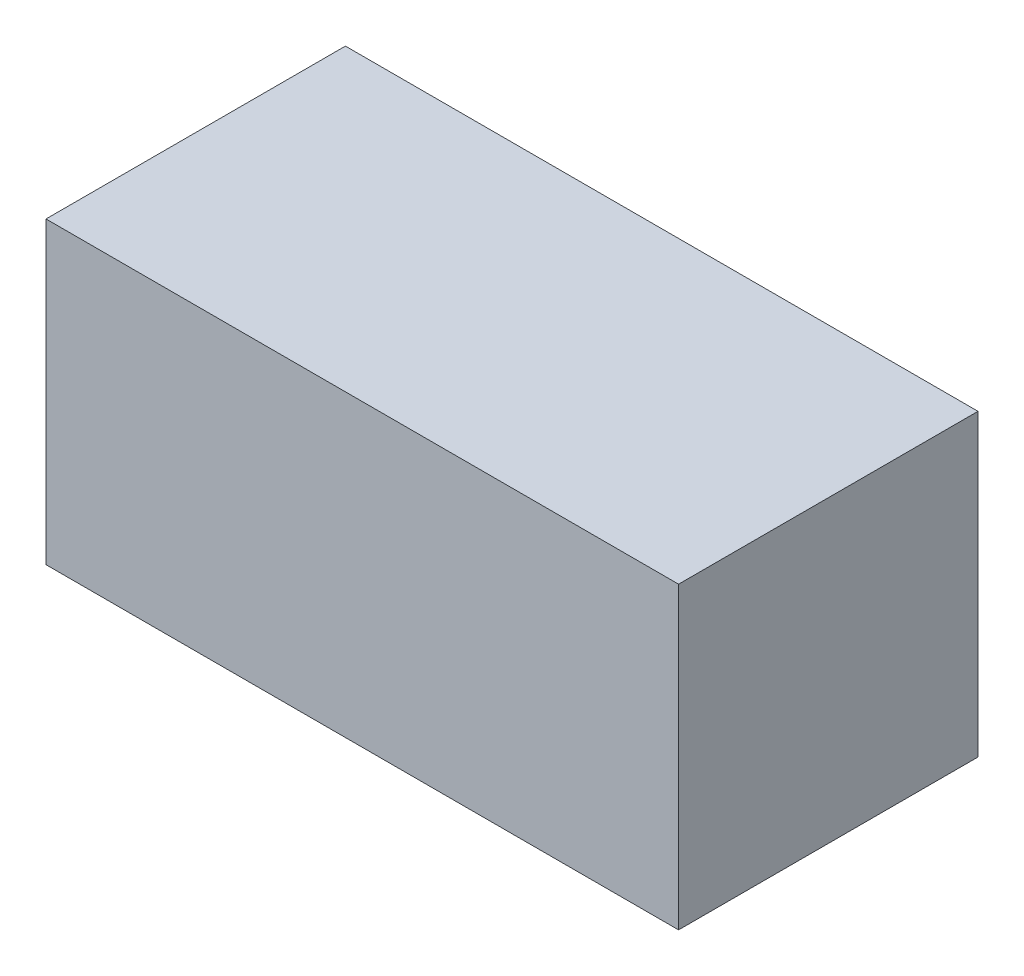
ISO-10303-21;
HEADER;
FILE_DESCRIPTION(('STEP AP214'),'2;1');
FILE_NAME('part.step','',(''),(''),'','','');
FILE_SCHEMA(('AUTOMOTIVE_DESIGN { 1 0 10303 214 1 1 1 1 }'));
ENDSEC;
DATA;
#1=APPLICATION_CONTEXT('core data for automotive mechanical design processes');
#2=APPLICATION_PROTOCOL_DEFINITION('international standard','automotive_design',2000,#1);
#3=PRODUCT_CONTEXT('',#1,'mechanical');
#4=PRODUCT('Part','Part','',(#3));
#5=PRODUCT_RELATED_PRODUCT_CATEGORY('part','',(#4));
#6=PRODUCT_DEFINITION_FORMATION('','',#4);
#7=PRODUCT_DEFINITION_CONTEXT('part definition',#1,'design');
#8=PRODUCT_DEFINITION('design','',#6,#7);
#9=PRODUCT_DEFINITION_SHAPE('','',#8);
#10=(LENGTH_UNIT() NAMED_UNIT(*) SI_UNIT(.MILLI.,.METRE.));
#11=(NAMED_UNIT(*) PLANE_ANGLE_UNIT() SI_UNIT($,.RADIAN.));
#12=(NAMED_UNIT(*) SI_UNIT($,.STERADIAN.) SOLID_ANGLE_UNIT());
#13=UNCERTAINTY_MEASURE_WITH_UNIT(LENGTH_MEASURE(1.E-05),#10,'distance_accuracy_value','');
#14=(GEOMETRIC_REPRESENTATION_CONTEXT(3) GLOBAL_UNCERTAINTY_ASSIGNED_CONTEXT((#13)) GLOBAL_UNIT_ASSIGNED_CONTEXT((#10,
#11,#12)) REPRESENTATION_CONTEXT('',''));
#15=CARTESIAN_POINT('',(0.,0.,0.));
#16=DIRECTION('',(0.,0.,1.));
#17=DIRECTION('',(1.,0.,0.));
#18=AXIS2_PLACEMENT_3D('',#15,#16,#17);
#19=CARTESIAN_POINT('',(37.5,-17.75,35.5));
#20=DIRECTION('',(-1.,0.,0.));
#21=DIRECTION('',(0.,0.,1.));
#22=AXIS2_PLACEMENT_3D('',#19,#20,#21);
#23=PLANE('',#22);
#24=DIRECTION('',(0.,1.,0.));
#25=VECTOR('',#24,1.);
#26=CARTESIAN_POINT('',(37.5,-17.75,0.));
#27=LINE('',#26,#25);
#28=CARTESIAN_POINT('',(37.5,-17.75,0.));
#29=VERTEX_POINT('',#28);
#30=CARTESIAN_POINT('',(37.5,17.75,0.));
#31=VERTEX_POINT('',#30);
#32=EDGE_CURVE('E102',#29,#31,#27,.T.);
#33=ORIENTED_EDGE('',*,*,#32,.T.);
#34=DIRECTION('',(0.,0.,-1.));
#35=VECTOR('',#34,1.);
#36=CARTESIAN_POINT('',(37.5,17.75,35.5));
#37=LINE('',#36,#35);
#38=CARTESIAN_POINT('',(37.5,17.75,35.5));
#39=VERTEX_POINT('',#38);
#40=EDGE_CURVE('E11',#39,#31,#37,.T.);
#41=ORIENTED_EDGE('',*,*,#40,.F.);
#42=DIRECTION('',(0.,1.,0.));
#43=VECTOR('',#42,1.);
#44=CARTESIAN_POINT('',(37.5,-17.75,35.5));
#45=LINE('',#44,#43);
#46=CARTESIAN_POINT('',(37.5,-17.75,35.5));
#47=VERTEX_POINT('',#46);
#48=EDGE_CURVE('E90',#47,#39,#45,.T.);
#49=ORIENTED_EDGE('',*,*,#48,.F.);
#50=DIRECTION('',(0.,0.,-1.));
#51=VECTOR('',#50,1.);
#52=CARTESIAN_POINT('',(37.5,-17.75,35.5));
#53=LINE('',#52,#51);
#54=EDGE_CURVE('E98',#47,#29,#53,.T.);
#55=ORIENTED_EDGE('',*,*,#54,.T.);
#56=EDGE_LOOP('',(#33,#41,#49,#55));
#57=FACE_BOUND('',#56,.T.);
#58=ADVANCED_FACE('F39',(#57),#23,.F.);
#59=CARTESIAN_POINT('',(-37.5,17.75,35.5));
#60=DIRECTION('',(0.,-1.,0.));
#61=DIRECTION('',(0.,0.,-1.));
#62=AXIS2_PLACEMENT_3D('',#59,#60,#61);
#63=PLANE('',#62);
#64=DIRECTION('',(-1.,0.,0.));
#65=VECTOR('',#64,1.);
#66=CARTESIAN_POINT('',(-37.5,17.75,0.));
#67=LINE('',#66,#65);
#68=CARTESIAN_POINT('',(-37.5,17.75,0.));
#69=VERTEX_POINT('',#68);
#70=EDGE_CURVE('E94',#31,#69,#67,.T.);
#71=ORIENTED_EDGE('',*,*,#70,.T.);
#72=DIRECTION('',(0.,0.,-1.));
#73=VECTOR('',#72,1.);
#74=CARTESIAN_POINT('',(-37.5,17.75,35.5));
#75=LINE('',#74,#73);
#76=CARTESIAN_POINT('',(-37.5,17.75,35.5));
#77=VERTEX_POINT('',#76);
#78=EDGE_CURVE('E47',#77,#69,#75,.T.);
#79=ORIENTED_EDGE('',*,*,#78,.F.);
#80=DIRECTION('',(-1.,0.,0.));
#81=VECTOR('',#80,1.);
#82=CARTESIAN_POINT('',(-37.5,17.75,35.5));
#83=LINE('',#82,#81);
#84=EDGE_CURVE('E85',#39,#77,#83,.T.);
#85=ORIENTED_EDGE('',*,*,#84,.F.);
#86=ORIENTED_EDGE('',*,*,#40,.T.);
#87=EDGE_LOOP('',(#71,#79,#85,#86));
#88=FACE_BOUND('',#87,.T.);
#89=ADVANCED_FACE('F93',(#88),#63,.F.);
#90=CARTESIAN_POINT('',(-37.5,-17.75,35.5));
#91=DIRECTION('',(1.,0.,0.));
#92=DIRECTION('',(0.,0.,-1.));
#93=AXIS2_PLACEMENT_3D('',#90,#91,#92);
#94=PLANE('',#93);
#95=DIRECTION('',(0.,-1.,0.));
#96=VECTOR('',#95,1.);
#97=CARTESIAN_POINT('',(-37.5,-17.75,0.));
#98=LINE('',#97,#96);
#99=CARTESIAN_POINT('',(-37.5,-17.75,0.));
#100=VERTEX_POINT('',#99);
#101=EDGE_CURVE('E72',#69,#100,#98,.T.);
#102=ORIENTED_EDGE('',*,*,#101,.T.);
#103=DIRECTION('',(0.,0.,-1.));
#104=VECTOR('',#103,1.);
#105=CARTESIAN_POINT('',(-37.5,-17.75,35.5));
#106=LINE('',#105,#104);
#107=CARTESIAN_POINT('',(-37.5,-17.75,35.5));
#108=VERTEX_POINT('',#107);
#109=EDGE_CURVE('E95',#108,#100,#106,.T.);
#110=ORIENTED_EDGE('',*,*,#109,.F.);
#111=DIRECTION('',(0.,-1.,0.));
#112=VECTOR('',#111,1.);
#113=CARTESIAN_POINT('',(-37.5,-17.75,35.5));
#114=LINE('',#113,#112);
#115=EDGE_CURVE('E88',#77,#108,#114,.T.);
#116=ORIENTED_EDGE('',*,*,#115,.F.);
#117=ORIENTED_EDGE('',*,*,#78,.T.);
#118=EDGE_LOOP('',(#102,#110,#116,#117));
#119=FACE_BOUND('',#118,.T.);
#120=ADVANCED_FACE('F96',(#119),#94,.F.);
#121=CARTESIAN_POINT('',(-37.5,-17.75,35.5));
#122=DIRECTION('',(0.,1.,0.));
#123=DIRECTION('',(0.,0.,1.));
#124=AXIS2_PLACEMENT_3D('',#121,#122,#123);
#125=PLANE('',#124);
#126=DIRECTION('',(1.,0.,0.));
#127=VECTOR('',#126,1.);
#128=CARTESIAN_POINT('',(-37.5,-17.75,0.));
#129=LINE('',#128,#127);
#130=EDGE_CURVE('E78',#100,#29,#129,.T.);
#131=ORIENTED_EDGE('',*,*,#130,.T.);
#132=ORIENTED_EDGE('',*,*,#54,.F.);
#133=DIRECTION('',(1.,0.,0.));
#134=VECTOR('',#133,1.);
#135=CARTESIAN_POINT('',(-37.5,-17.75,35.5));
#136=LINE('',#135,#134);
#137=EDGE_CURVE('E55',#108,#47,#136,.T.);
#138=ORIENTED_EDGE('',*,*,#137,.F.);
#139=ORIENTED_EDGE('',*,*,#109,.T.);
#140=EDGE_LOOP('',(#131,#132,#138,#139));
#141=FACE_BOUND('',#140,.T.);
#142=ADVANCED_FACE('F109',(#141),#125,.F.);
#143=CARTESIAN_POINT('',(0.,0.,35.5));
#144=DIRECTION('',(0.,0.,-1.));
#145=DIRECTION('',(-1.,0.,0.));
#146=AXIS2_PLACEMENT_3D('',#143,#144,#145);
#147=PLANE('',#146);
#148=ORIENTED_EDGE('',*,*,#48,.T.);
#149=ORIENTED_EDGE('',*,*,#84,.T.);
#150=ORIENTED_EDGE('',*,*,#115,.T.);
#151=ORIENTED_EDGE('',*,*,#137,.T.);
#152=EDGE_LOOP('',(#148,#149,#150,#151));
#153=FACE_BOUND('',#152,.T.);
#154=ADVANCED_FACE('F86',(#153),#147,.F.);
#155=CARTESIAN_POINT('',(0.,0.,0.));
#156=DIRECTION('',(0.,0.,-1.));
#157=DIRECTION('',(-1.,0.,0.));
#158=AXIS2_PLACEMENT_3D('',#155,#156,#157);
#159=PLANE('',#158);
#160=ORIENTED_EDGE('',*,*,#32,.F.);
#161=ORIENTED_EDGE('',*,*,#130,.F.);
#162=ORIENTED_EDGE('',*,*,#101,.F.);
#163=ORIENTED_EDGE('',*,*,#70,.F.);
#164=EDGE_LOOP('',(#160,#161,#162,#163));
#165=FACE_BOUND('',#164,.T.);
#166=ADVANCED_FACE('F112',(#165),#159,.T.);
#167=CLOSED_SHELL('',(#58,#89,#120,#142,#154,#166));
#168=MANIFOLD_SOLID_BREP('B2',#167);
#169=ADVANCED_BREP_SHAPE_REPRESENTATION('',(#18,#168),#14);
#170=SHAPE_DEFINITION_REPRESENTATION(#9,#169);
ENDSEC;
END-ISO-10303-21;
